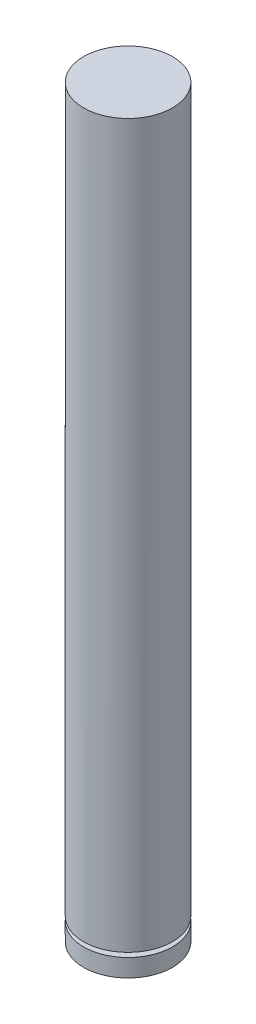
ISO-10303-21;
HEADER;
FILE_DESCRIPTION(('STEP AP214'),'2;1');
FILE_NAME('part.step','',(''),(''),'','','');
FILE_SCHEMA(('AUTOMOTIVE_DESIGN { 1 0 10303 214 1 1 1 1 }'));
ENDSEC;
DATA;
#1=APPLICATION_CONTEXT('core data for automotive mechanical design processes');
#2=APPLICATION_PROTOCOL_DEFINITION('international standard','automotive_design',2000,#1);
#3=PRODUCT_CONTEXT('',#1,'mechanical');
#4=PRODUCT('Part','Part','',(#3));
#5=PRODUCT_RELATED_PRODUCT_CATEGORY('part','',(#4));
#6=PRODUCT_DEFINITION_FORMATION('','',#4);
#7=PRODUCT_DEFINITION_CONTEXT('part definition',#1,'design');
#8=PRODUCT_DEFINITION('design','',#6,#7);
#9=PRODUCT_DEFINITION_SHAPE('','',#8);
#10=(LENGTH_UNIT() NAMED_UNIT(*) SI_UNIT(.MILLI.,.METRE.));
#11=(NAMED_UNIT(*) PLANE_ANGLE_UNIT() SI_UNIT($,.RADIAN.));
#12=(NAMED_UNIT(*) SI_UNIT($,.STERADIAN.) SOLID_ANGLE_UNIT());
#13=UNCERTAINTY_MEASURE_WITH_UNIT(LENGTH_MEASURE(1.E-05),#10,'distance_accuracy_value','');
#14=(GEOMETRIC_REPRESENTATION_CONTEXT(3) GLOBAL_UNCERTAINTY_ASSIGNED_CONTEXT((#13)) GLOBAL_UNIT_ASSIGNED_CONTEXT((#10,
#11,#12)) REPRESENTATION_CONTEXT('',''));
#15=CARTESIAN_POINT('',(0.,0.,0.));
#16=DIRECTION('',(0.,0.,1.));
#17=DIRECTION('',(1.,0.,0.));
#18=AXIS2_PLACEMENT_3D('',#15,#16,#17);
#19=CARTESIAN_POINT('',(0.,33.5,0.));
#20=DIRECTION('',(0.,-1.,0.));
#21=DIRECTION('',(0.,0.,-1.));
#22=AXIS2_PLACEMENT_3D('',#19,#20,#21);
#23=CYLINDRICAL_SURFACE('',#22,2.);
#24=CARTESIAN_POINT('',(0.,0.,0.));
#25=DIRECTION('',(0.,1.,0.));
#26=DIRECTION('',(0.,0.,1.));
#27=AXIS2_PLACEMENT_3D('',#24,#25,#26);
#28=CIRCLE('',#27,2.);
#29=CARTESIAN_POINT('',(0.,0.,2.));
#30=VERTEX_POINT('',#29);
#31=EDGE_CURVE('E36',#30,#30,#28,.T.);
#32=ORIENTED_EDGE('',*,*,#31,.T.);
#33=EDGE_LOOP('',(#32));
#34=FACE_BOUND('',#33,.T.);
#35=CARTESIAN_POINT('',(0.,0.799999999999999,0.));
#36=DIRECTION('',(0.,-1.,0.));
#37=DIRECTION('',(0.,0.,-1.));
#38=AXIS2_PLACEMENT_3D('',#35,#36,#37);
#39=CIRCLE('',#38,2.);
#40=CARTESIAN_POINT('',(0.,0.799999999999999,-2.));
#41=VERTEX_POINT('',#40);
#42=EDGE_CURVE('E47',#41,#41,#39,.T.);
#43=ORIENTED_EDGE('',*,*,#42,.T.);
#44=EDGE_LOOP('',(#43));
#45=FACE_BOUND('',#44,.T.);
#46=ADVANCED_FACE('F32',(#34,#45),#23,.T.);
#47=CARTESIAN_POINT('',(0.,0.,0.));
#48=DIRECTION('',(0.,1.,0.));
#49=DIRECTION('',(0.,0.,1.));
#50=AXIS2_PLACEMENT_3D('',#47,#48,#49);
#51=PLANE('',#50);
#52=ORIENTED_EDGE('',*,*,#31,.F.);
#53=EDGE_LOOP('',(#52));
#54=FACE_BOUND('',#53,.T.);
#55=ADVANCED_FACE('F75',(#54),#51,.F.);
#56=CARTESIAN_POINT('',(0.,-1.7,0.));
#57=DIRECTION('',(0.,-1.,0.));
#58=DIRECTION('',(0.,0.,-1.));
#59=AXIS2_PLACEMENT_3D('',#56,#57,#58);
#60=CYLINDRICAL_SURFACE('',#59,1.5);
#61=CARTESIAN_POINT('',(0.,1.,0.));
#62=DIRECTION('',(0.,-1.,0.));
#63=DIRECTION('',(0.,0.,-1.));
#64=AXIS2_PLACEMENT_3D('',#61,#62,#63);
#65=CIRCLE('',#64,1.5);
#66=CARTESIAN_POINT('',(0.,1.,-1.5));
#67=VERTEX_POINT('',#66);
#68=EDGE_CURVE('E53',#67,#67,#65,.T.);
#69=ORIENTED_EDGE('',*,*,#68,.T.);
#70=EDGE_LOOP('',(#69));
#71=FACE_BOUND('',#70,.T.);
#72=CARTESIAN_POINT('',(0.,0.8,0.));
#73=DIRECTION('',(0.,-1.,0.));
#74=DIRECTION('',(0.,0.,-1.));
#75=AXIS2_PLACEMENT_3D('',#72,#73,#74);
#76=CIRCLE('',#75,1.5);
#77=CARTESIAN_POINT('',(0.,0.8,-1.5));
#78=VERTEX_POINT('',#77);
#79=EDGE_CURVE('E43',#78,#78,#76,.T.);
#80=ORIENTED_EDGE('',*,*,#79,.F.);
#81=EDGE_LOOP('',(#80));
#82=FACE_BOUND('',#81,.T.);
#83=ADVANCED_FACE('F57',(#71,#82),#60,.T.);
#84=CARTESIAN_POINT('',(0.,0.8,0.));
#85=DIRECTION('',(0.,1.,0.));
#86=DIRECTION('',(0.,0.,1.));
#87=AXIS2_PLACEMENT_3D('',#84,#85,#86);
#88=PLANE('',#87);
#89=ORIENTED_EDGE('',*,*,#79,.T.);
#90=EDGE_LOOP('',(#89));
#91=FACE_BOUND('',#90,.T.);
#92=ORIENTED_EDGE('',*,*,#42,.F.);
#93=EDGE_LOOP('',(#92));
#94=FACE_BOUND('',#93,.T.);
#95=ADVANCED_FACE('F64',(#91,#94),#88,.T.);
#96=CARTESIAN_POINT('',(0.,1.,0.));
#97=DIRECTION('',(0.,1.,0.));
#98=DIRECTION('',(0.,0.,1.));
#99=AXIS2_PLACEMENT_3D('',#96,#97,#98);
#100=PLANE('',#99);
#101=ORIENTED_EDGE('',*,*,#68,.F.);
#102=EDGE_LOOP('',(#101));
#103=FACE_BOUND('',#102,.T.);
#104=CARTESIAN_POINT('',(0.,1.,0.));
#105=DIRECTION('',(0.,-1.,0.));
#106=DIRECTION('',(0.,0.,-1.));
#107=AXIS2_PLACEMENT_3D('',#104,#105,#106);
#108=CIRCLE('',#107,2.);
#109=CARTESIAN_POINT('',(0.,1.,-2.));
#110=VERTEX_POINT('',#109);
#111=EDGE_CURVE('E50',#110,#110,#108,.T.);
#112=ORIENTED_EDGE('',*,*,#111,.T.);
#113=EDGE_LOOP('',(#112));
#114=FACE_BOUND('',#113,.T.);
#115=ADVANCED_FACE('F60',(#103,#114),#100,.F.);
#116=CARTESIAN_POINT('',(0.,33.5,0.));
#117=DIRECTION('',(0.,1.,0.));
#118=DIRECTION('',(0.,0.,1.));
#119=AXIS2_PLACEMENT_3D('',#116,#117,#118);
#120=PLANE('',#119);
#121=CARTESIAN_POINT('',(0.,33.5,0.));
#122=DIRECTION('',(0.,1.,0.));
#123=DIRECTION('',(0.,0.,1.));
#124=AXIS2_PLACEMENT_3D('',#121,#122,#123);
#125=CIRCLE('',#124,2.);
#126=CARTESIAN_POINT('',(0.,33.5,2.));
#127=VERTEX_POINT('',#126);
#128=EDGE_CURVE('E10',#127,#127,#125,.T.);
#129=ORIENTED_EDGE('',*,*,#128,.T.);
#130=EDGE_LOOP('',(#129));
#131=FACE_BOUND('',#130,.T.);
#132=ADVANCED_FACE('F63',(#131),#120,.T.);
#133=ORIENTED_EDGE('',*,*,#111,.F.);
#134=EDGE_LOOP('',(#133));
#135=FACE_BOUND('',#134,.T.);
#136=ORIENTED_EDGE('',*,*,#128,.F.);
#137=EDGE_LOOP('',(#136));
#138=FACE_BOUND('',#137,.T.);
#139=ADVANCED_FACE('F34',(#135,#138),#23,.T.);
#140=CLOSED_SHELL('',(#46,#55,#83,#95,#115,#132,#139));
#141=MANIFOLD_SOLID_BREP('B2',#140);
#142=ADVANCED_BREP_SHAPE_REPRESENTATION('',(#18,#141),#14);
#143=SHAPE_DEFINITION_REPRESENTATION(#9,#142);
ENDSEC;
END-ISO-10303-21;
